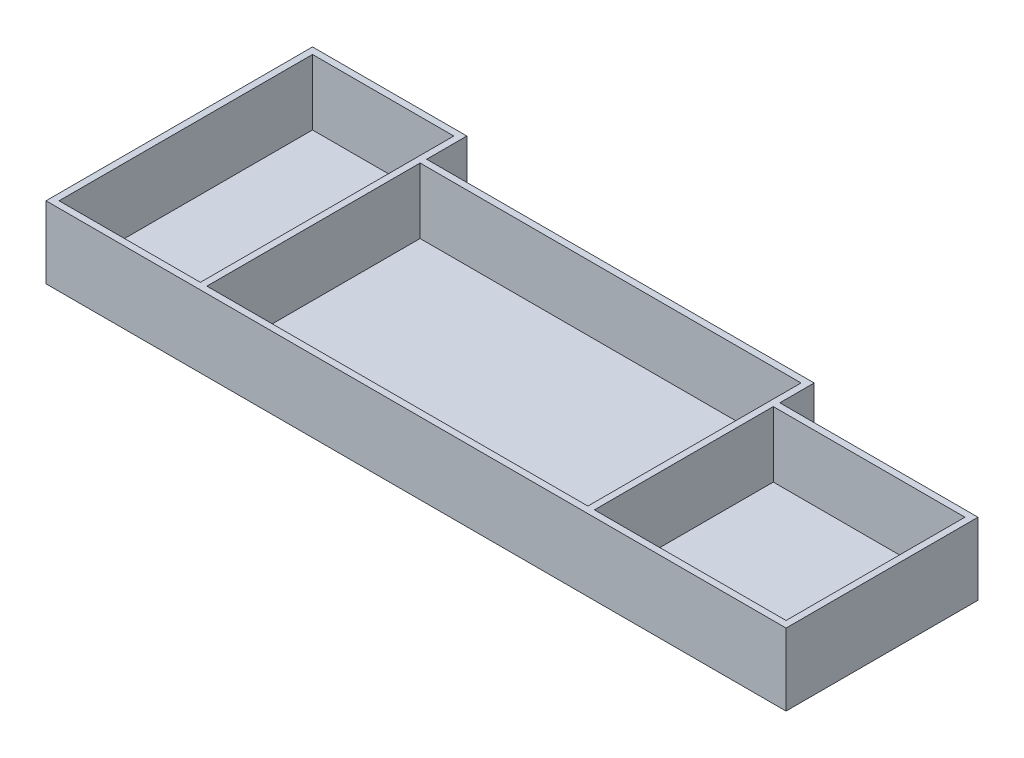
ISO-10303-21;
HEADER;
FILE_DESCRIPTION(('STEP AP214'),'2;1');
FILE_NAME('part.step','',(''),(''),'','','');
FILE_SCHEMA(('AUTOMOTIVE_DESIGN { 1 0 10303 214 1 1 1 1 }'));
ENDSEC;
DATA;
#1=APPLICATION_CONTEXT('core data for automotive mechanical design processes');
#2=APPLICATION_PROTOCOL_DEFINITION('international standard','automotive_design',2000,#1);
#3=PRODUCT_CONTEXT('',#1,'mechanical');
#4=PRODUCT('Part','Part','',(#3));
#5=PRODUCT_RELATED_PRODUCT_CATEGORY('part','',(#4));
#6=PRODUCT_DEFINITION_FORMATION('','',#4);
#7=PRODUCT_DEFINITION_CONTEXT('part definition',#1,'design');
#8=PRODUCT_DEFINITION('design','',#6,#7);
#9=PRODUCT_DEFINITION_SHAPE('','',#8);
#10=(LENGTH_UNIT() NAMED_UNIT(*) SI_UNIT(.MILLI.,.METRE.));
#11=(NAMED_UNIT(*) PLANE_ANGLE_UNIT() SI_UNIT($,.RADIAN.));
#12=(NAMED_UNIT(*) SI_UNIT($,.STERADIAN.) SOLID_ANGLE_UNIT());
#13=UNCERTAINTY_MEASURE_WITH_UNIT(LENGTH_MEASURE(1.E-05),#10,'distance_accuracy_value','');
#14=(GEOMETRIC_REPRESENTATION_CONTEXT(3) GLOBAL_UNCERTAINTY_ASSIGNED_CONTEXT((#13)) GLOBAL_UNIT_ASSIGNED_CONTEXT((#10,
#11,#12)) REPRESENTATION_CONTEXT('',''));
#15=CARTESIAN_POINT('',(0.,0.,0.));
#16=DIRECTION('',(0.,0.,1.));
#17=DIRECTION('',(1.,0.,0.));
#18=AXIS2_PLACEMENT_3D('',#15,#16,#17);
#19=CARTESIAN_POINT('',(0.,-2.,0.));
#20=DIRECTION('',(1.,0.,0.));
#21=DIRECTION('',(0.,0.,-1.));
#22=AXIS2_PLACEMENT_3D('',#19,#20,#21);
#23=PLANE('',#22);
#24=DIRECTION('',(0.,1.,0.));
#25=VECTOR('',#24,1.);
#26=CARTESIAN_POINT('',(0.,-2.,0.));
#27=LINE('',#26,#25);
#28=CARTESIAN_POINT('',(0.,-2.,0.));
#29=VERTEX_POINT('',#28);
#30=CARTESIAN_POINT('',(0.,20.,0.));
#31=VERTEX_POINT('',#30);
#32=EDGE_CURVE('E44',#29,#31,#27,.T.);
#33=ORIENTED_EDGE('',*,*,#32,.T.);
#34=DIRECTION('',(0.,0.,-1.));
#35=VECTOR('',#34,1.);
#36=CARTESIAN_POINT('',(0.,20.,0.));
#37=LINE('',#36,#35);
#38=CARTESIAN_POINT('',(0.,20.,-81.5));
#39=VERTEX_POINT('',#38);
#40=EDGE_CURVE('E182',#31,#39,#37,.T.);
#41=ORIENTED_EDGE('',*,*,#40,.T.);
#42=DIRECTION('',(0.,1.,0.));
#43=VECTOR('',#42,1.);
#44=CARTESIAN_POINT('',(0.,-2.,-81.5));
#45=LINE('',#44,#43);
#46=CARTESIAN_POINT('',(0.,-2.,-81.5));
#47=VERTEX_POINT('',#46);
#48=EDGE_CURVE('E11',#47,#39,#45,.T.);
#49=ORIENTED_EDGE('',*,*,#48,.F.);
#50=DIRECTION('',(0.,0.,-1.));
#51=VECTOR('',#50,1.);
#52=CARTESIAN_POINT('',(0.,-2.,0.));
#53=LINE('',#52,#51);
#54=EDGE_CURVE('E185',#29,#47,#53,.T.);
#55=ORIENTED_EDGE('',*,*,#54,.F.);
#56=EDGE_LOOP('',(#33,#41,#49,#55));
#57=FACE_BOUND('',#56,.T.);
#58=ADVANCED_FACE('F41',(#57),#23,.F.);
#59=CARTESIAN_POINT('',(0.,-2.,-81.5));
#60=DIRECTION('',(0.,0.,1.));
#61=DIRECTION('',(1.,0.,0.));
#62=AXIS2_PLACEMENT_3D('',#59,#60,#61);
#63=PLANE('',#62);
#64=ORIENTED_EDGE('',*,*,#48,.T.);
#65=DIRECTION('',(1.,0.,0.));
#66=VECTOR('',#65,1.);
#67=CARTESIAN_POINT('',(0.,20.,-81.5));
#68=LINE('',#67,#66);
#69=CARTESIAN_POINT('',(47.2,20.,-81.5));
#70=VERTEX_POINT('',#69);
#71=EDGE_CURVE('E206',#39,#70,#68,.T.);
#72=ORIENTED_EDGE('',*,*,#71,.T.);
#73=DIRECTION('',(0.,1.,0.));
#74=VECTOR('',#73,1.);
#75=CARTESIAN_POINT('',(47.2,-2.,-81.5));
#76=LINE('',#75,#74);
#77=CARTESIAN_POINT('',(47.2,-2.,-81.5));
#78=VERTEX_POINT('',#77);
#79=EDGE_CURVE('E50',#78,#70,#76,.T.);
#80=ORIENTED_EDGE('',*,*,#79,.F.);
#81=DIRECTION('',(1.,0.,0.));
#82=VECTOR('',#81,1.);
#83=CARTESIAN_POINT('',(0.,-2.,-81.5));
#84=LINE('',#83,#82);
#85=EDGE_CURVE('E191',#47,#78,#84,.T.);
#86=ORIENTED_EDGE('',*,*,#85,.F.);
#87=EDGE_LOOP('',(#64,#72,#80,#86));
#88=FACE_BOUND('',#87,.T.);
#89=ADVANCED_FACE('F414',(#88),#63,.F.);
#90=CARTESIAN_POINT('',(47.2,-2.,0.));
#91=DIRECTION('',(-1.,0.,0.));
#92=DIRECTION('',(0.,0.,1.));
#93=AXIS2_PLACEMENT_3D('',#90,#91,#92);
#94=PLANE('',#93);
#95=ORIENTED_EDGE('',*,*,#79,.T.);
#96=DIRECTION('',(0.,0.,1.));
#97=VECTOR('',#96,1.);
#98=CARTESIAN_POINT('',(47.2,20.,0.));
#99=LINE('',#98,#97);
#100=CARTESIAN_POINT('',(47.2,20.,-69.2));
#101=VERTEX_POINT('',#100);
#102=EDGE_CURVE('E228',#70,#101,#99,.T.);
#103=ORIENTED_EDGE('',*,*,#102,.T.);
#104=DIRECTION('',(0.,1.,0.));
#105=VECTOR('',#104,1.);
#106=CARTESIAN_POINT('',(47.2,-2.,-69.2));
#107=LINE('',#106,#105);
#108=CARTESIAN_POINT('',(47.2,-2.,-69.2));
#109=VERTEX_POINT('',#108);
#110=EDGE_CURVE('E378',#109,#101,#107,.T.);
#111=ORIENTED_EDGE('',*,*,#110,.F.);
#112=DIRECTION('',(0.,0.,1.));
#113=VECTOR('',#112,1.);
#114=CARTESIAN_POINT('',(47.2,-2.,0.));
#115=LINE('',#114,#113);
#116=EDGE_CURVE('E371',#78,#109,#115,.T.);
#117=ORIENTED_EDGE('',*,*,#116,.F.);
#118=EDGE_LOOP('',(#95,#103,#111,#117));
#119=FACE_BOUND('',#118,.T.);
#120=ADVANCED_FACE('F411',(#119),#94,.F.);
#121=CARTESIAN_POINT('',(0.,-2.,-69.2));
#122=DIRECTION('',(0.,0.,1.));
#123=DIRECTION('',(1.,0.,0.));
#124=AXIS2_PLACEMENT_3D('',#121,#122,#123);
#125=PLANE('',#124);
#126=ORIENTED_EDGE('',*,*,#110,.T.);
#127=DIRECTION('',(1.,0.,0.));
#128=VECTOR('',#127,1.);
#129=CARTESIAN_POINT('',(0.,20.,-69.2));
#130=LINE('',#129,#128);
#131=CARTESIAN_POINT('',(165.7,20.,-69.2));
#132=VERTEX_POINT('',#131);
#133=EDGE_CURVE('E224',#101,#132,#130,.T.);
#134=ORIENTED_EDGE('',*,*,#133,.T.);
#135=DIRECTION('',(0.,1.,0.));
#136=VECTOR('',#135,1.);
#137=CARTESIAN_POINT('',(165.7,-2.,-69.2));
#138=LINE('',#137,#136);
#139=CARTESIAN_POINT('',(165.7,-2.,-69.2));
#140=VERTEX_POINT('',#139);
#141=EDGE_CURVE('E381',#140,#132,#138,.T.);
#142=ORIENTED_EDGE('',*,*,#141,.F.);
#143=DIRECTION('',(1.,0.,0.));
#144=VECTOR('',#143,1.);
#145=CARTESIAN_POINT('',(0.,-2.,-69.2));
#146=LINE('',#145,#144);
#147=EDGE_CURVE('E368',#109,#140,#146,.T.);
#148=ORIENTED_EDGE('',*,*,#147,.F.);
#149=EDGE_LOOP('',(#126,#134,#142,#148));
#150=FACE_BOUND('',#149,.T.);
#151=ADVANCED_FACE('F406',(#150),#125,.F.);
#152=CARTESIAN_POINT('',(165.7,-2.,0.));
#153=DIRECTION('',(-1.,0.,0.));
#154=DIRECTION('',(0.,0.,1.));
#155=AXIS2_PLACEMENT_3D('',#152,#153,#154);
#156=PLANE('',#155);
#157=ORIENTED_EDGE('',*,*,#141,.T.);
#158=DIRECTION('',(0.,0.,1.));
#159=VECTOR('',#158,1.);
#160=CARTESIAN_POINT('',(165.7,20.,0.));
#161=LINE('',#160,#159);
#162=CARTESIAN_POINT('',(165.7,20.,-58.7));
#163=VERTEX_POINT('',#162);
#164=EDGE_CURVE('E220',#132,#163,#161,.T.);
#165=ORIENTED_EDGE('',*,*,#164,.T.);
#166=DIRECTION('',(0.,1.,0.));
#167=VECTOR('',#166,1.);
#168=CARTESIAN_POINT('',(165.7,-2.,-58.7));
#169=LINE('',#168,#167);
#170=CARTESIAN_POINT('',(165.7,-2.,-58.7));
#171=VERTEX_POINT('',#170);
#172=EDGE_CURVE('E384',#171,#163,#169,.T.);
#173=ORIENTED_EDGE('',*,*,#172,.F.);
#174=DIRECTION('',(0.,0.,1.));
#175=VECTOR('',#174,1.);
#176=CARTESIAN_POINT('',(165.7,-2.,0.));
#177=LINE('',#176,#175);
#178=EDGE_CURVE('E365',#140,#171,#177,.T.);
#179=ORIENTED_EDGE('',*,*,#178,.F.);
#180=EDGE_LOOP('',(#157,#165,#173,#179));
#181=FACE_BOUND('',#180,.T.);
#182=ADVANCED_FACE('F402',(#181),#156,.F.);
#183=CARTESIAN_POINT('',(0.,-2.,-58.7));
#184=DIRECTION('',(0.,0.,1.));
#185=DIRECTION('',(1.,0.,0.));
#186=AXIS2_PLACEMENT_3D('',#183,#184,#185);
#187=PLANE('',#186);
#188=ORIENTED_EDGE('',*,*,#172,.T.);
#189=DIRECTION('',(1.,0.,0.));
#190=VECTOR('',#189,1.);
#191=CARTESIAN_POINT('',(0.,20.,-58.7));
#192=LINE('',#191,#190);
#193=CARTESIAN_POINT('',(226.3,20.,-58.7));
#194=VERTEX_POINT('',#193);
#195=EDGE_CURVE('E216',#163,#194,#192,.T.);
#196=ORIENTED_EDGE('',*,*,#195,.T.);
#197=DIRECTION('',(0.,1.,0.));
#198=VECTOR('',#197,1.);
#199=CARTESIAN_POINT('',(226.3,-2.,-58.7));
#200=LINE('',#199,#198);
#201=CARTESIAN_POINT('',(226.3,-2.,-58.7));
#202=VERTEX_POINT('',#201);
#203=EDGE_CURVE('E387',#202,#194,#200,.T.);
#204=ORIENTED_EDGE('',*,*,#203,.F.);
#205=DIRECTION('',(1.,0.,0.));
#206=VECTOR('',#205,1.);
#207=CARTESIAN_POINT('',(0.,-2.,-58.7));
#208=LINE('',#207,#206);
#209=EDGE_CURVE('E362',#171,#202,#208,.T.);
#210=ORIENTED_EDGE('',*,*,#209,.F.);
#211=EDGE_LOOP('',(#188,#196,#204,#210));
#212=FACE_BOUND('',#211,.T.);
#213=ADVANCED_FACE('F398',(#212),#187,.F.);
#214=CARTESIAN_POINT('',(226.3,-2.,-1.00081196666565E-13));
#215=DIRECTION('',(-1.,0.,0.));
#216=DIRECTION('',(0.,0.,1.));
#217=AXIS2_PLACEMENT_3D('',#214,#215,#216);
#218=PLANE('',#217);
#219=ORIENTED_EDGE('',*,*,#203,.T.);
#220=DIRECTION('',(0.,0.,1.));
#221=VECTOR('',#220,1.);
#222=CARTESIAN_POINT('',(226.3,20.,-1.00081196666565E-13));
#223=LINE('',#222,#221);
#224=CARTESIAN_POINT('',(226.3,20.,0.));
#225=VERTEX_POINT('',#224);
#226=EDGE_CURVE('E200',#194,#225,#223,.T.);
#227=ORIENTED_EDGE('',*,*,#226,.T.);
#228=DIRECTION('',(0.,1.,0.));
#229=VECTOR('',#228,1.);
#230=CARTESIAN_POINT('',(226.3,-2.,0.));
#231=LINE('',#230,#229);
#232=CARTESIAN_POINT('',(226.3,-2.,0.));
#233=VERTEX_POINT('',#232);
#234=EDGE_CURVE('E190',#233,#225,#231,.T.);
#235=ORIENTED_EDGE('',*,*,#234,.F.);
#236=DIRECTION('',(0.,0.,1.));
#237=VECTOR('',#236,1.);
#238=CARTESIAN_POINT('',(226.3,-2.,-1.00081196666565E-13));
#239=LINE('',#238,#237);
#240=EDGE_CURVE('E359',#202,#233,#239,.T.);
#241=ORIENTED_EDGE('',*,*,#240,.F.);
#242=EDGE_LOOP('',(#219,#227,#235,#241));
#243=FACE_BOUND('',#242,.T.);
#244=ADVANCED_FACE('F393',(#243),#218,.F.);
#245=CARTESIAN_POINT('',(0.,-2.,0.));
#246=DIRECTION('',(0.,0.,1.));
#247=DIRECTION('',(1.,0.,0.));
#248=AXIS2_PLACEMENT_3D('',#245,#246,#247);
#249=PLANE('',#248);
#250=ORIENTED_EDGE('',*,*,#234,.T.);
#251=DIRECTION('',(1.,0.,0.));
#252=VECTOR('',#251,1.);
#253=CARTESIAN_POINT('',(0.,20.,0.));
#254=LINE('',#253,#252);
#255=EDGE_CURVE('E193',#31,#225,#254,.T.);
#256=ORIENTED_EDGE('',*,*,#255,.F.);
#257=ORIENTED_EDGE('',*,*,#32,.F.);
#258=DIRECTION('',(1.,0.,0.));
#259=VECTOR('',#258,1.);
#260=CARTESIAN_POINT('',(0.,-2.,0.));
#261=LINE('',#260,#259);
#262=EDGE_CURVE('E356',#29,#233,#261,.T.);
#263=ORIENTED_EDGE('',*,*,#262,.T.);
#264=EDGE_LOOP('',(#250,#256,#257,#263));
#265=FACE_BOUND('',#264,.T.);
#266=ADVANCED_FACE('F194',(#265),#249,.T.);
#267=CARTESIAN_POINT('',(0.,-2.,0.));
#268=DIRECTION('',(0.,1.,0.));
#269=DIRECTION('',(0.,0.,1.));
#270=AXIS2_PLACEMENT_3D('',#267,#268,#269);
#271=PLANE('',#270);
#272=ORIENTED_EDGE('',*,*,#54,.T.);
#273=ORIENTED_EDGE('',*,*,#85,.T.);
#274=ORIENTED_EDGE('',*,*,#116,.T.);
#275=ORIENTED_EDGE('',*,*,#147,.T.);
#276=ORIENTED_EDGE('',*,*,#178,.T.);
#277=ORIENTED_EDGE('',*,*,#209,.T.);
#278=ORIENTED_EDGE('',*,*,#240,.T.);
#279=ORIENTED_EDGE('',*,*,#262,.F.);
#280=EDGE_LOOP('',(#272,#273,#274,#275,#276,#277,#278,#279));
#281=FACE_BOUND('',#280,.T.);
#282=ADVANCED_FACE('F416',(#281),#271,.F.);
#283=CARTESIAN_POINT('',(0.,20.,-67.2));
#284=DIRECTION('',(0.,0.,-1.));
#285=DIRECTION('',(-1.,0.,0.));
#286=AXIS2_PLACEMENT_3D('',#283,#284,#285);
#287=PLANE('',#286);
#288=DIRECTION('',(1.,0.,0.));
#289=VECTOR('',#288,1.);
#290=CARTESIAN_POINT('',(0.,0.,-67.2));
#291=LINE('',#290,#289);
#292=CARTESIAN_POINT('',(47.2,0.,-67.2));
#293=VERTEX_POINT('',#292);
#294=CARTESIAN_POINT('',(163.7,0.,-67.2));
#295=VERTEX_POINT('',#294);
#296=EDGE_CURVE('E305',#293,#295,#291,.T.);
#297=ORIENTED_EDGE('',*,*,#296,.T.);
#298=DIRECTION('',(0.,-1.,0.));
#299=VECTOR('',#298,1.);
#300=CARTESIAN_POINT('',(163.7,20.,-67.2));
#301=LINE('',#300,#299);
#302=CARTESIAN_POINT('',(163.7,20.,-67.2));
#303=VERTEX_POINT('',#302);
#304=EDGE_CURVE('E328',#303,#295,#301,.T.);
#305=ORIENTED_EDGE('',*,*,#304,.F.);
#306=DIRECTION('',(1.,0.,0.));
#307=VECTOR('',#306,1.);
#308=CARTESIAN_POINT('',(0.,20.,-67.2));
#309=LINE('',#308,#307);
#310=CARTESIAN_POINT('',(47.2,20.,-67.2));
#311=VERTEX_POINT('',#310);
#312=EDGE_CURVE('E263',#311,#303,#309,.T.);
#313=ORIENTED_EDGE('',*,*,#312,.F.);
#314=DIRECTION('',(0.,-1.,0.));
#315=VECTOR('',#314,1.);
#316=CARTESIAN_POINT('',(47.2,20.,-67.2));
#317=LINE('',#316,#315);
#318=EDGE_CURVE('E316',#311,#293,#317,.T.);
#319=ORIENTED_EDGE('',*,*,#318,.T.);
#320=EDGE_LOOP('',(#297,#305,#313,#319));
#321=FACE_BOUND('',#320,.T.);
#322=ADVANCED_FACE('F418',(#321),#287,.F.);
#323=CARTESIAN_POINT('',(163.7,20.,0.));
#324=DIRECTION('',(1.,0.,0.));
#325=DIRECTION('',(0.,0.,-1.));
#326=AXIS2_PLACEMENT_3D('',#323,#324,#325);
#327=PLANE('',#326);
#328=DIRECTION('',(0.,0.,1.));
#329=VECTOR('',#328,1.);
#330=CARTESIAN_POINT('',(163.7,0.,0.));
#331=LINE('',#330,#329);
#332=CARTESIAN_POINT('',(163.7,0.,-2.));
#333=VERTEX_POINT('',#332);
#334=EDGE_CURVE('E309',#295,#333,#331,.T.);
#335=ORIENTED_EDGE('',*,*,#334,.T.);
#336=DIRECTION('',(0.,-1.,0.));
#337=VECTOR('',#336,1.);
#338=CARTESIAN_POINT('',(163.7,20.,-2.));
#339=LINE('',#338,#337);
#340=CARTESIAN_POINT('',(163.7,20.,-2.));
#341=VERTEX_POINT('',#340);
#342=EDGE_CURVE('E325',#341,#333,#339,.T.);
#343=ORIENTED_EDGE('',*,*,#342,.F.);
#344=DIRECTION('',(0.,0.,1.));
#345=VECTOR('',#344,1.);
#346=CARTESIAN_POINT('',(163.7,20.,0.));
#347=LINE('',#346,#345);
#348=EDGE_CURVE('E267',#303,#341,#347,.T.);
#349=ORIENTED_EDGE('',*,*,#348,.F.);
#350=ORIENTED_EDGE('',*,*,#304,.T.);
#351=EDGE_LOOP('',(#335,#343,#349,#350));
#352=FACE_BOUND('',#351,.T.);
#353=ADVANCED_FACE('F424',(#352),#327,.F.);
#354=CARTESIAN_POINT('',(0.,20.,-2.));
#355=DIRECTION('',(0.,0.,-1.));
#356=DIRECTION('',(-1.,0.,0.));
#357=AXIS2_PLACEMENT_3D('',#354,#355,#356);
#358=PLANE('',#357);
#359=DIRECTION('',(1.,0.,0.));
#360=VECTOR('',#359,1.);
#361=CARTESIAN_POINT('',(0.,0.,-2.));
#362=LINE('',#361,#360);
#363=CARTESIAN_POINT('',(47.2,0.,-2.));
#364=VERTEX_POINT('',#363);
#365=EDGE_CURVE('E211',#364,#333,#362,.T.);
#366=ORIENTED_EDGE('',*,*,#365,.F.);
#367=DIRECTION('',(0.,-1.,0.));
#368=VECTOR('',#367,1.);
#369=CARTESIAN_POINT('',(47.2,20.,-2.));
#370=LINE('',#369,#368);
#371=CARTESIAN_POINT('',(47.2,20.,-2.));
#372=VERTEX_POINT('',#371);
#373=EDGE_CURVE('E320',#372,#364,#370,.T.);
#374=ORIENTED_EDGE('',*,*,#373,.F.);
#375=DIRECTION('',(1.,0.,0.));
#376=VECTOR('',#375,1.);
#377=CARTESIAN_POINT('',(0.,20.,-2.));
#378=LINE('',#377,#376);
#379=EDGE_CURVE('E270',#372,#341,#378,.T.);
#380=ORIENTED_EDGE('',*,*,#379,.T.);
#381=ORIENTED_EDGE('',*,*,#342,.T.);
#382=EDGE_LOOP('',(#366,#374,#380,#381));
#383=FACE_BOUND('',#382,.T.);
#384=ADVANCED_FACE('F472',(#383),#358,.T.);
#385=CARTESIAN_POINT('',(0.,20.,-79.5));
#386=DIRECTION('',(0.,0.,-1.));
#387=DIRECTION('',(-1.,0.,0.));
#388=AXIS2_PLACEMENT_3D('',#385,#386,#387);
#389=PLANE('',#388);
#390=DIRECTION('',(1.,0.,0.));
#391=VECTOR('',#390,1.);
#392=CARTESIAN_POINT('',(0.,0.,-79.5));
#393=LINE('',#392,#391);
#394=CARTESIAN_POINT('',(2.,0.,-79.5));
#395=VERTEX_POINT('',#394);
#396=CARTESIAN_POINT('',(45.2,0.,-79.5));
#397=VERTEX_POINT('',#396);
#398=EDGE_CURVE('E292',#395,#397,#393,.T.);
#399=ORIENTED_EDGE('',*,*,#398,.T.);
#400=DIRECTION('',(0.,-1.,0.));
#401=VECTOR('',#400,1.);
#402=CARTESIAN_POINT('',(45.2,20.,-79.5));
#403=LINE('',#402,#401);
#404=CARTESIAN_POINT('',(45.2,20.,-79.5));
#405=VERTEX_POINT('',#404);
#406=EDGE_CURVE('E321',#405,#397,#403,.T.);
#407=ORIENTED_EDGE('',*,*,#406,.F.);
#408=DIRECTION('',(1.,0.,0.));
#409=VECTOR('',#408,1.);
#410=CARTESIAN_POINT('',(0.,20.,-79.5));
#411=LINE('',#410,#409);
#412=CARTESIAN_POINT('',(2.,20.,-79.5));
#413=VERTEX_POINT('',#412);
#414=EDGE_CURVE('E249',#413,#405,#411,.T.);
#415=ORIENTED_EDGE('',*,*,#414,.F.);
#416=DIRECTION('',(0.,-1.,0.));
#417=VECTOR('',#416,1.);
#418=CARTESIAN_POINT('',(2.,20.,-79.5));
#419=LINE('',#418,#417);
#420=EDGE_CURVE('E331',#413,#395,#419,.T.);
#421=ORIENTED_EDGE('',*,*,#420,.T.);
#422=EDGE_LOOP('',(#399,#407,#415,#421));
#423=FACE_BOUND('',#422,.T.);
#424=ADVANCED_FACE('F483',(#423),#389,.F.);
#425=CARTESIAN_POINT('',(45.2,20.,0.));
#426=DIRECTION('',(1.,0.,0.));
#427=DIRECTION('',(0.,0.,-1.));
#428=AXIS2_PLACEMENT_3D('',#425,#426,#427);
#429=PLANE('',#428);
#430=DIRECTION('',(0.,0.,1.));
#431=VECTOR('',#430,1.);
#432=CARTESIAN_POINT('',(45.2,0.,0.));
#433=LINE('',#432,#431);
#434=CARTESIAN_POINT('',(45.2,0.,-2.));
#435=VERTEX_POINT('',#434);
#436=EDGE_CURVE('E296',#397,#435,#433,.T.);
#437=ORIENTED_EDGE('',*,*,#436,.T.);
#438=DIRECTION('',(0.,-1.,0.));
#439=VECTOR('',#438,1.);
#440=CARTESIAN_POINT('',(45.2,20.,-2.));
#441=LINE('',#440,#439);
#442=CARTESIAN_POINT('',(45.2,20.,-2.));
#443=VERTEX_POINT('',#442);
#444=EDGE_CURVE('E339',#443,#435,#441,.T.);
#445=ORIENTED_EDGE('',*,*,#444,.F.);
#446=DIRECTION('',(0.,0.,1.));
#447=VECTOR('',#446,1.);
#448=CARTESIAN_POINT('',(45.2,20.,0.));
#449=LINE('',#448,#447);
#450=EDGE_CURVE('E253',#405,#443,#449,.T.);
#451=ORIENTED_EDGE('',*,*,#450,.F.);
#452=ORIENTED_EDGE('',*,*,#406,.T.);
#453=EDGE_LOOP('',(#437,#445,#451,#452));
#454=FACE_BOUND('',#453,.T.);
#455=ADVANCED_FACE('F493',(#454),#429,.F.);
#456=CARTESIAN_POINT('',(0.,20.,-2.));
#457=DIRECTION('',(0.,0.,-1.));
#458=DIRECTION('',(-1.,0.,0.));
#459=AXIS2_PLACEMENT_3D('',#456,#457,#458);
#460=PLANE('',#459);
#461=DIRECTION('',(1.,0.,0.));
#462=VECTOR('',#461,1.);
#463=CARTESIAN_POINT('',(0.,0.,-2.));
#464=LINE('',#463,#462);
#465=CARTESIAN_POINT('',(2.,0.,-2.));
#466=VERTEX_POINT('',#465);
#467=EDGE_CURVE('E58',#466,#435,#464,.T.);
#468=ORIENTED_EDGE('',*,*,#467,.F.);
#469=DIRECTION('',(0.,-1.,0.));
#470=VECTOR('',#469,1.);
#471=CARTESIAN_POINT('',(2.,20.,-2.));
#472=LINE('',#471,#470);
#473=CARTESIAN_POINT('',(2.,20.,-2.));
#474=VERTEX_POINT('',#473);
#475=EDGE_CURVE('E335',#474,#466,#472,.T.);
#476=ORIENTED_EDGE('',*,*,#475,.F.);
#477=DIRECTION('',(1.,0.,0.));
#478=VECTOR('',#477,1.);
#479=CARTESIAN_POINT('',(0.,20.,-2.));
#480=LINE('',#479,#478);
#481=EDGE_CURVE('E256',#474,#443,#480,.T.);
#482=ORIENTED_EDGE('',*,*,#481,.T.);
#483=ORIENTED_EDGE('',*,*,#444,.T.);
#484=EDGE_LOOP('',(#468,#476,#482,#483));
#485=FACE_BOUND('',#484,.T.);
#486=ADVANCED_FACE('F504',(#485),#460,.T.);
#487=CARTESIAN_POINT('',(0.,20.,-56.7));
#488=DIRECTION('',(0.,0.,1.));
#489=DIRECTION('',(1.,0.,0.));
#490=AXIS2_PLACEMENT_3D('',#487,#488,#489);
#491=PLANE('',#490);
#492=DIRECTION('',(-1.,0.,0.));
#493=VECTOR('',#492,1.);
#494=CARTESIAN_POINT('',(0.,0.,-56.7));
#495=LINE('',#494,#493);
#496=CARTESIAN_POINT('',(224.3,0.,-56.7));
#497=VERTEX_POINT('',#496);
#498=CARTESIAN_POINT('',(165.7,0.,-56.7));
#499=VERTEX_POINT('',#498);
#500=EDGE_CURVE('E278',#497,#499,#495,.T.);
#501=ORIENTED_EDGE('',*,*,#500,.F.);
#502=DIRECTION('',(0.,-1.,0.));
#503=VECTOR('',#502,1.);
#504=CARTESIAN_POINT('',(224.3,20.,-56.7));
#505=LINE('',#504,#503);
#506=CARTESIAN_POINT('',(224.3,20.,-56.7));
#507=VERTEX_POINT('',#506);
#508=EDGE_CURVE('E336',#507,#497,#505,.T.);
#509=ORIENTED_EDGE('',*,*,#508,.F.);
#510=DIRECTION('',(-1.,0.,0.));
#511=VECTOR('',#510,1.);
#512=CARTESIAN_POINT('',(0.,20.,-56.7));
#513=LINE('',#512,#511);
#514=CARTESIAN_POINT('',(165.7,20.,-56.7));
#515=VERTEX_POINT('',#514);
#516=EDGE_CURVE('E234',#507,#515,#513,.T.);
#517=ORIENTED_EDGE('',*,*,#516,.T.);
#518=DIRECTION('',(0.,-1.,0.));
#519=VECTOR('',#518,1.);
#520=CARTESIAN_POINT('',(165.7,20.,-56.7));
#521=LINE('',#520,#519);
#522=EDGE_CURVE('E277',#515,#499,#521,.T.);
#523=ORIENTED_EDGE('',*,*,#522,.T.);
#524=EDGE_LOOP('',(#501,#509,#517,#523));
#525=FACE_BOUND('',#524,.T.);
#526=ADVANCED_FACE('F515',(#525),#491,.T.);
#527=CARTESIAN_POINT('',(224.3,20.,0.));
#528=DIRECTION('',(-1.,0.,0.));
#529=DIRECTION('',(0.,0.,1.));
#530=AXIS2_PLACEMENT_3D('',#527,#528,#529);
#531=PLANE('',#530);
#532=DIRECTION('',(0.,0.,-1.));
#533=VECTOR('',#532,1.);
#534=CARTESIAN_POINT('',(224.3,0.,0.));
#535=LINE('',#534,#533);
#536=CARTESIAN_POINT('',(224.3,0.,-2.));
#537=VERTEX_POINT('',#536);
#538=EDGE_CURVE('E282',#537,#497,#535,.T.);
#539=ORIENTED_EDGE('',*,*,#538,.F.);
#540=DIRECTION('',(0.,-1.,0.));
#541=VECTOR('',#540,1.);
#542=CARTESIAN_POINT('',(224.3,20.,-2.));
#543=LINE('',#542,#541);
#544=CARTESIAN_POINT('',(224.3,20.,-2.));
#545=VERTEX_POINT('',#544);
#546=EDGE_CURVE('E349',#545,#537,#543,.T.);
#547=ORIENTED_EDGE('',*,*,#546,.F.);
#548=DIRECTION('',(0.,0.,-1.));
#549=VECTOR('',#548,1.);
#550=CARTESIAN_POINT('',(224.3,20.,0.));
#551=LINE('',#550,#549);
#552=EDGE_CURVE('E238',#545,#507,#551,.T.);
#553=ORIENTED_EDGE('',*,*,#552,.T.);
#554=ORIENTED_EDGE('',*,*,#508,.T.);
#555=EDGE_LOOP('',(#539,#547,#553,#554));
#556=FACE_BOUND('',#555,.T.);
#557=ADVANCED_FACE('F524',(#556),#531,.T.);
#558=CARTESIAN_POINT('',(0.,20.,-2.));
#559=DIRECTION('',(0.,0.,-1.));
#560=DIRECTION('',(-1.,0.,0.));
#561=AXIS2_PLACEMENT_3D('',#558,#559,#560);
#562=PLANE('',#561);
#563=DIRECTION('',(1.,0.,0.));
#564=VECTOR('',#563,1.);
#565=CARTESIAN_POINT('',(0.,0.,-2.));
#566=LINE('',#565,#564);
#567=CARTESIAN_POINT('',(165.7,0.,-2.));
#568=VERTEX_POINT('',#567);
#569=EDGE_CURVE('E66',#568,#537,#566,.T.);
#570=ORIENTED_EDGE('',*,*,#569,.F.);
#571=DIRECTION('',(0.,-1.,0.));
#572=VECTOR('',#571,1.);
#573=CARTESIAN_POINT('',(165.7,20.,-2.));
#574=LINE('',#573,#572);
#575=CARTESIAN_POINT('',(165.7,20.,-2.));
#576=VERTEX_POINT('',#575);
#577=EDGE_CURVE('E346',#576,#568,#574,.T.);
#578=ORIENTED_EDGE('',*,*,#577,.F.);
#579=DIRECTION('',(1.,0.,0.));
#580=VECTOR('',#579,1.);
#581=CARTESIAN_POINT('',(0.,20.,-2.));
#582=LINE('',#581,#580);
#583=EDGE_CURVE('E242',#576,#545,#582,.T.);
#584=ORIENTED_EDGE('',*,*,#583,.T.);
#585=ORIENTED_EDGE('',*,*,#546,.T.);
#586=EDGE_LOOP('',(#570,#578,#584,#585));
#587=FACE_BOUND('',#586,.T.);
#588=ADVANCED_FACE('F533',(#587),#562,.T.);
#589=CARTESIAN_POINT('',(2.,20.,0.));
#590=DIRECTION('',(-1.,0.,0.));
#591=DIRECTION('',(0.,0.,1.));
#592=AXIS2_PLACEMENT_3D('',#589,#590,#591);
#593=PLANE('',#592);
#594=DIRECTION('',(0.,0.,-1.));
#595=VECTOR('',#594,1.);
#596=CARTESIAN_POINT('',(2.,0.,0.));
#597=LINE('',#596,#595);
#598=EDGE_CURVE('E302',#466,#395,#597,.T.);
#599=ORIENTED_EDGE('',*,*,#598,.T.);
#600=ORIENTED_EDGE('',*,*,#420,.F.);
#601=DIRECTION('',(0.,0.,-1.));
#602=VECTOR('',#601,1.);
#603=CARTESIAN_POINT('',(2.,20.,0.));
#604=LINE('',#603,#602);
#605=EDGE_CURVE('E260',#474,#413,#604,.T.);
#606=ORIENTED_EDGE('',*,*,#605,.F.);
#607=ORIENTED_EDGE('',*,*,#475,.T.);
#608=EDGE_LOOP('',(#599,#600,#606,#607));
#609=FACE_BOUND('',#608,.T.);
#610=ADVANCED_FACE('F543',(#609),#593,.F.);
#611=CARTESIAN_POINT('',(165.7,20.,0.));
#612=DIRECTION('',(-1.,0.,0.));
#613=DIRECTION('',(0.,0.,1.));
#614=AXIS2_PLACEMENT_3D('',#611,#612,#613);
#615=PLANE('',#614);
#616=DIRECTION('',(0.,0.,-1.));
#617=VECTOR('',#616,1.);
#618=CARTESIAN_POINT('',(165.7,0.,0.));
#619=LINE('',#618,#617);
#620=EDGE_CURVE('E288',#568,#499,#619,.T.);
#621=ORIENTED_EDGE('',*,*,#620,.T.);
#622=ORIENTED_EDGE('',*,*,#522,.F.);
#623=DIRECTION('',(0.,0.,-1.));
#624=VECTOR('',#623,1.);
#625=CARTESIAN_POINT('',(165.7,20.,0.));
#626=LINE('',#625,#624);
#627=EDGE_CURVE('E246',#576,#515,#626,.T.);
#628=ORIENTED_EDGE('',*,*,#627,.F.);
#629=ORIENTED_EDGE('',*,*,#577,.T.);
#630=EDGE_LOOP('',(#621,#622,#628,#629));
#631=FACE_BOUND('',#630,.T.);
#632=ADVANCED_FACE('F552',(#631),#615,.F.);
#633=CARTESIAN_POINT('',(47.2,20.,0.));
#634=DIRECTION('',(-1.,0.,0.));
#635=DIRECTION('',(0.,0.,1.));
#636=AXIS2_PLACEMENT_3D('',#633,#634,#635);
#637=PLANE('',#636);
#638=DIRECTION('',(0.,0.,-1.));
#639=VECTOR('',#638,1.);
#640=CARTESIAN_POINT('',(47.2,0.,0.));
#641=LINE('',#640,#639);
#642=EDGE_CURVE('E208',#364,#293,#641,.T.);
#643=ORIENTED_EDGE('',*,*,#642,.T.);
#644=ORIENTED_EDGE('',*,*,#318,.F.);
#645=DIRECTION('',(0.,0.,-1.));
#646=VECTOR('',#645,1.);
#647=CARTESIAN_POINT('',(47.2,20.,0.));
#648=LINE('',#647,#646);
#649=EDGE_CURVE('E274',#372,#311,#648,.T.);
#650=ORIENTED_EDGE('',*,*,#649,.F.);
#651=ORIENTED_EDGE('',*,*,#373,.T.);
#652=EDGE_LOOP('',(#643,#644,#650,#651));
#653=FACE_BOUND('',#652,.T.);
#654=ADVANCED_FACE('F562',(#653),#637,.F.);
#655=CARTESIAN_POINT('',(0.,20.,0.));
#656=DIRECTION('',(0.,1.,0.));
#657=DIRECTION('',(0.,0.,1.));
#658=AXIS2_PLACEMENT_3D('',#655,#656,#657);
#659=PLANE('',#658);
#660=ORIENTED_EDGE('',*,*,#40,.F.);
#661=ORIENTED_EDGE('',*,*,#255,.T.);
#662=ORIENTED_EDGE('',*,*,#226,.F.);
#663=ORIENTED_EDGE('',*,*,#195,.F.);
#664=ORIENTED_EDGE('',*,*,#164,.F.);
#665=ORIENTED_EDGE('',*,*,#133,.F.);
#666=ORIENTED_EDGE('',*,*,#102,.F.);
#667=ORIENTED_EDGE('',*,*,#71,.F.);
#668=EDGE_LOOP('',(#660,#661,#662,#663,#664,#665,#666,#667));
#669=FACE_BOUND('',#668,.T.);
#670=ORIENTED_EDGE('',*,*,#516,.F.);
#671=ORIENTED_EDGE('',*,*,#552,.F.);
#672=ORIENTED_EDGE('',*,*,#583,.F.);
#673=ORIENTED_EDGE('',*,*,#627,.T.);
#674=EDGE_LOOP('',(#670,#671,#672,#673));
#675=FACE_BOUND('',#674,.T.);
#676=ORIENTED_EDGE('',*,*,#414,.T.);
#677=ORIENTED_EDGE('',*,*,#450,.T.);
#678=ORIENTED_EDGE('',*,*,#481,.F.);
#679=ORIENTED_EDGE('',*,*,#605,.T.);
#680=EDGE_LOOP('',(#676,#677,#678,#679));
#681=FACE_BOUND('',#680,.T.);
#682=ORIENTED_EDGE('',*,*,#312,.T.);
#683=ORIENTED_EDGE('',*,*,#348,.T.);
#684=ORIENTED_EDGE('',*,*,#379,.F.);
#685=ORIENTED_EDGE('',*,*,#649,.T.);
#686=EDGE_LOOP('',(#682,#683,#684,#685));
#687=FACE_BOUND('',#686,.T.);
#688=ADVANCED_FACE('F202',(#669,#675,#681,#687),#659,.T.);
#689=CARTESIAN_POINT('',(0.,0.,0.));
#690=DIRECTION('',(0.,1.,0.));
#691=DIRECTION('',(0.,0.,1.));
#692=AXIS2_PLACEMENT_3D('',#689,#690,#691);
#693=PLANE('',#692);
#694=ORIENTED_EDGE('',*,*,#500,.T.);
#695=ORIENTED_EDGE('',*,*,#620,.F.);
#696=ORIENTED_EDGE('',*,*,#569,.T.);
#697=ORIENTED_EDGE('',*,*,#538,.T.);
#698=EDGE_LOOP('',(#694,#695,#696,#697));
#699=FACE_BOUND('',#698,.T.);
#700=ADVANCED_FACE('F438',(#699),#693,.T.);
#701=ORIENTED_EDGE('',*,*,#436,.F.);
#702=ORIENTED_EDGE('',*,*,#398,.F.);
#703=ORIENTED_EDGE('',*,*,#598,.F.);
#704=ORIENTED_EDGE('',*,*,#467,.T.);
#705=EDGE_LOOP('',(#701,#702,#703,#704));
#706=FACE_BOUND('',#705,.T.);
#707=ADVANCED_FACE('F589',(#706),#693,.T.);
#708=ORIENTED_EDGE('',*,*,#334,.F.);
#709=ORIENTED_EDGE('',*,*,#296,.F.);
#710=ORIENTED_EDGE('',*,*,#642,.F.);
#711=ORIENTED_EDGE('',*,*,#365,.T.);
#712=EDGE_LOOP('',(#708,#709,#710,#711));
#713=FACE_BOUND('',#712,.T.);
#714=ADVANCED_FACE('F591',(#713),#693,.T.);
#715=CLOSED_SHELL('',(#58,#89,#120,#151,#182,#213,#244,#266,#282,#322,#353,#384,#424,#455,#486,
#526,#557,#588,#610,#632,#654,#688,#700,#707,#714));
#716=MANIFOLD_SOLID_BREP('B2',#715);
#717=ADVANCED_BREP_SHAPE_REPRESENTATION('',(#18,#716),#14);
#718=SHAPE_DEFINITION_REPRESENTATION(#9,#717);
ENDSEC;
END-ISO-10303-21;
